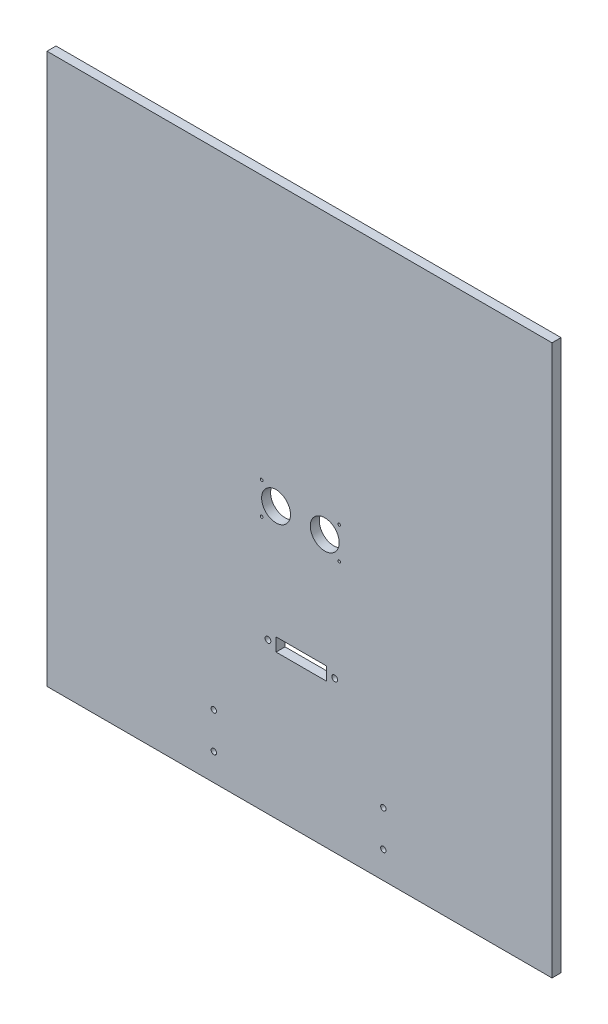
ISO-10303-21;
HEADER;
FILE_DESCRIPTION(('STEP AP214'),'2;1');
FILE_NAME('part.step','',(''),(''),'','','');
FILE_SCHEMA(('AUTOMOTIVE_DESIGN { 1 0 10303 214 1 1 1 1 }'));
ENDSEC;
DATA;
#1=APPLICATION_CONTEXT('core data for automotive mechanical design processes');
#2=APPLICATION_PROTOCOL_DEFINITION('international standard','automotive_design',2000,#1);
#3=PRODUCT_CONTEXT('',#1,'mechanical');
#4=PRODUCT('Part','Part','',(#3));
#5=PRODUCT_RELATED_PRODUCT_CATEGORY('part','',(#4));
#6=PRODUCT_DEFINITION_FORMATION('','',#4);
#7=PRODUCT_DEFINITION_CONTEXT('part definition',#1,'design');
#8=PRODUCT_DEFINITION('design','',#6,#7);
#9=PRODUCT_DEFINITION_SHAPE('','',#8);
#10=(LENGTH_UNIT() NAMED_UNIT(*) SI_UNIT(.MILLI.,.METRE.));
#11=(NAMED_UNIT(*) PLANE_ANGLE_UNIT() SI_UNIT($,.RADIAN.));
#12=(NAMED_UNIT(*) SI_UNIT($,.STERADIAN.) SOLID_ANGLE_UNIT());
#13=UNCERTAINTY_MEASURE_WITH_UNIT(LENGTH_MEASURE(1.E-05),#10,'distance_accuracy_value','');
#14=(GEOMETRIC_REPRESENTATION_CONTEXT(3) GLOBAL_UNCERTAINTY_ASSIGNED_CONTEXT((#13)) GLOBAL_UNIT_ASSIGNED_CONTEXT((#10,
#11,#12)) REPRESENTATION_CONTEXT('',''));
#15=CARTESIAN_POINT('',(0.,0.,0.));
#16=DIRECTION('',(0.,0.,1.));
#17=DIRECTION('',(1.,0.,0.));
#18=AXIS2_PLACEMENT_3D('',#15,#16,#17);
#19=CARTESIAN_POINT('',(0.,0.,5.));
#20=DIRECTION('',(1.,0.,0.));
#21=DIRECTION('',(0.,0.,-1.));
#22=AXIS2_PLACEMENT_3D('',#19,#20,#21);
#23=PLANE('',#22);
#24=DIRECTION('',(0.,-1.,0.));
#25=VECTOR('',#24,1.);
#26=CARTESIAN_POINT('',(0.,0.,0.));
#27=LINE('',#26,#25);
#28=CARTESIAN_POINT('',(0.,305.,0.));
#29=VERTEX_POINT('',#28);
#30=CARTESIAN_POINT('',(0.,0.,0.));
#31=VERTEX_POINT('',#30);
#32=EDGE_CURVE('E158',#29,#31,#27,.T.);
#33=ORIENTED_EDGE('',*,*,#32,.T.);
#34=DIRECTION('',(0.,0.,-1.));
#35=VECTOR('',#34,1.);
#36=CARTESIAN_POINT('',(0.,0.,5.));
#37=LINE('',#36,#35);
#38=CARTESIAN_POINT('',(0.,0.,5.));
#39=VERTEX_POINT('',#38);
#40=EDGE_CURVE('E11',#39,#31,#37,.T.);
#41=ORIENTED_EDGE('',*,*,#40,.F.);
#42=DIRECTION('',(0.,-1.,0.));
#43=VECTOR('',#42,1.);
#44=CARTESIAN_POINT('',(0.,0.,5.));
#45=LINE('',#44,#43);
#46=CARTESIAN_POINT('',(0.,305.,5.));
#47=VERTEX_POINT('',#46);
#48=EDGE_CURVE('E161',#47,#39,#45,.T.);
#49=ORIENTED_EDGE('',*,*,#48,.F.);
#50=DIRECTION('',(0.,0.,-1.));
#51=VECTOR('',#50,1.);
#52=CARTESIAN_POINT('',(0.,305.,5.));
#53=LINE('',#52,#51);
#54=EDGE_CURVE('E171',#47,#29,#53,.T.);
#55=ORIENTED_EDGE('',*,*,#54,.T.);
#56=EDGE_LOOP('',(#33,#41,#49,#55));
#57=FACE_BOUND('',#56,.T.);
#58=ADVANCED_FACE('F32',(#57),#23,.F.);
#59=CARTESIAN_POINT('',(0.,0.,5.));
#60=DIRECTION('',(0.,1.,0.));
#61=DIRECTION('',(0.,0.,1.));
#62=AXIS2_PLACEMENT_3D('',#59,#60,#61);
#63=PLANE('',#62);
#64=DIRECTION('',(1.,0.,0.));
#65=VECTOR('',#64,1.);
#66=CARTESIAN_POINT('',(0.,0.,0.));
#67=LINE('',#66,#65);
#68=CARTESIAN_POINT('',(280.,0.,0.));
#69=VERTEX_POINT('',#68);
#70=EDGE_CURVE('E174',#31,#69,#67,.T.);
#71=ORIENTED_EDGE('',*,*,#70,.T.);
#72=DIRECTION('',(0.,0.,-1.));
#73=VECTOR('',#72,1.);
#74=CARTESIAN_POINT('',(280.,0.,5.));
#75=LINE('',#74,#73);
#76=CARTESIAN_POINT('',(280.,0.,5.));
#77=VERTEX_POINT('',#76);
#78=EDGE_CURVE('E39',#77,#69,#75,.T.);
#79=ORIENTED_EDGE('',*,*,#78,.F.);
#80=DIRECTION('',(1.,0.,0.));
#81=VECTOR('',#80,1.);
#82=CARTESIAN_POINT('',(0.,0.,5.));
#83=LINE('',#82,#81);
#84=EDGE_CURVE('E164',#39,#77,#83,.T.);
#85=ORIENTED_EDGE('',*,*,#84,.F.);
#86=ORIENTED_EDGE('',*,*,#40,.T.);
#87=EDGE_LOOP('',(#71,#79,#85,#86));
#88=FACE_BOUND('',#87,.T.);
#89=ADVANCED_FACE('F203',(#88),#63,.F.);
#90=CARTESIAN_POINT('',(280.,0.,5.));
#91=DIRECTION('',(-1.,0.,0.));
#92=DIRECTION('',(0.,0.,1.));
#93=AXIS2_PLACEMENT_3D('',#90,#91,#92);
#94=PLANE('',#93);
#95=DIRECTION('',(0.,1.,0.));
#96=VECTOR('',#95,1.);
#97=CARTESIAN_POINT('',(280.,0.,0.));
#98=LINE('',#97,#96);
#99=CARTESIAN_POINT('',(280.,305.,0.));
#100=VERTEX_POINT('',#99);
#101=EDGE_CURVE('E176',#69,#100,#98,.T.);
#102=ORIENTED_EDGE('',*,*,#101,.T.);
#103=DIRECTION('',(0.,0.,-1.));
#104=VECTOR('',#103,1.);
#105=CARTESIAN_POINT('',(280.,305.,5.));
#106=LINE('',#105,#104);
#107=CARTESIAN_POINT('',(280.,305.,5.));
#108=VERTEX_POINT('',#107);
#109=EDGE_CURVE('E181',#108,#100,#106,.T.);
#110=ORIENTED_EDGE('',*,*,#109,.F.);
#111=DIRECTION('',(0.,1.,0.));
#112=VECTOR('',#111,1.);
#113=CARTESIAN_POINT('',(280.,0.,5.));
#114=LINE('',#113,#112);
#115=EDGE_CURVE('E167',#77,#108,#114,.T.);
#116=ORIENTED_EDGE('',*,*,#115,.F.);
#117=ORIENTED_EDGE('',*,*,#78,.T.);
#118=EDGE_LOOP('',(#102,#110,#116,#117));
#119=FACE_BOUND('',#118,.T.);
#120=ADVANCED_FACE('F188',(#119),#94,.F.);
#121=CARTESIAN_POINT('',(0.,305.,5.));
#122=DIRECTION('',(0.,-1.,0.));
#123=DIRECTION('',(0.,0.,-1.));
#124=AXIS2_PLACEMENT_3D('',#121,#122,#123);
#125=PLANE('',#124);
#126=DIRECTION('',(-1.,0.,0.));
#127=VECTOR('',#126,1.);
#128=CARTESIAN_POINT('',(0.,305.,0.));
#129=LINE('',#128,#127);
#130=EDGE_CURVE('E165',#100,#29,#129,.T.);
#131=ORIENTED_EDGE('',*,*,#130,.T.);
#132=ORIENTED_EDGE('',*,*,#54,.F.);
#133=DIRECTION('',(-1.,0.,0.));
#134=VECTOR('',#133,1.);
#135=CARTESIAN_POINT('',(0.,305.,5.));
#136=LINE('',#135,#134);
#137=EDGE_CURVE('E169',#108,#47,#136,.T.);
#138=ORIENTED_EDGE('',*,*,#137,.F.);
#139=ORIENTED_EDGE('',*,*,#109,.T.);
#140=EDGE_LOOP('',(#131,#132,#138,#139));
#141=FACE_BOUND('',#140,.T.);
#142=ADVANCED_FACE('F197',(#141),#125,.F.);
#143=CARTESIAN_POINT('',(0.,0.,5.));
#144=DIRECTION('',(0.,0.,-1.));
#145=DIRECTION('',(-1.,0.,0.));
#146=AXIS2_PLACEMENT_3D('',#143,#144,#145);
#147=PLANE('',#146);
#148=CARTESIAN_POINT('',(119.,141.,5.));
#149=DIRECTION('',(0.,0.,-1.));
#150=DIRECTION('',(-1.,0.,0.));
#151=AXIS2_PLACEMENT_3D('',#148,#149,#150);
#152=CIRCLE('',#151,0.749999999999999);
#153=CARTESIAN_POINT('',(118.25,141.,5.));
#154=VERTEX_POINT('',#153);
#155=EDGE_CURVE('E297',#154,#154,#152,.T.);
#156=ORIENTED_EDGE('',*,*,#155,.T.);
#157=EDGE_LOOP('',(#156));
#158=FACE_BOUND('',#157,.T.);
#159=CARTESIAN_POINT('',(162.,141.,5.));
#160=DIRECTION('',(0.,0.,-1.));
#161=DIRECTION('',(-1.,0.,0.));
#162=AXIS2_PLACEMENT_3D('',#159,#160,#161);
#163=CIRCLE('',#162,0.750000000000012);
#164=CARTESIAN_POINT('',(161.25,141.,5.));
#165=VERTEX_POINT('',#164);
#166=EDGE_CURVE('E287',#165,#165,#163,.T.);
#167=ORIENTED_EDGE('',*,*,#166,.T.);
#168=EDGE_LOOP('',(#167));
#169=FACE_BOUND('',#168,.T.);
#170=CARTESIAN_POINT('',(162.,158.7,5.));
#171=DIRECTION('',(0.,0.,-1.));
#172=DIRECTION('',(-1.,0.,0.));
#173=AXIS2_PLACEMENT_3D('',#170,#171,#172);
#174=CIRCLE('',#173,0.750000000000012);
#175=CARTESIAN_POINT('',(161.25,158.7,5.));
#176=VERTEX_POINT('',#175);
#177=EDGE_CURVE('E282',#176,#176,#174,.T.);
#178=ORIENTED_EDGE('',*,*,#177,.T.);
#179=EDGE_LOOP('',(#178));
#180=FACE_BOUND('',#179,.T.);
#181=CARTESIAN_POINT('',(127.,150.,5.));
#182=DIRECTION('',(0.,0.,-1.));
#183=DIRECTION('',(-1.,0.,0.));
#184=AXIS2_PLACEMENT_3D('',#181,#182,#183);
#185=CIRCLE('',#184,8.00000000000004);
#186=CARTESIAN_POINT('',(119.,150.,5.));
#187=VERTEX_POINT('',#186);
#188=EDGE_CURVE('E309',#187,#187,#185,.T.);
#189=ORIENTED_EDGE('',*,*,#188,.T.);
#190=EDGE_LOOP('',(#189));
#191=FACE_BOUND('',#190,.T.);
#192=CARTESIAN_POINT('',(119.,158.7,5.));
#193=DIRECTION('',(0.,0.,-1.));
#194=DIRECTION('',(-1.,0.,0.));
#195=AXIS2_PLACEMENT_3D('',#192,#193,#194);
#196=CIRCLE('',#195,0.749999999999999);
#197=CARTESIAN_POINT('',(118.25,158.7,5.));
#198=VERTEX_POINT('',#197);
#199=EDGE_CURVE('E303',#198,#198,#196,.T.);
#200=ORIENTED_EDGE('',*,*,#199,.T.);
#201=EDGE_LOOP('',(#200));
#202=FACE_BOUND('',#201,.T.);
#203=CARTESIAN_POINT('',(154.,150.,5.));
#204=DIRECTION('',(0.,0.,-1.));
#205=DIRECTION('',(-1.,0.,0.));
#206=AXIS2_PLACEMENT_3D('',#203,#204,#205);
#207=CIRCLE('',#206,8.00000000000001);
#208=CARTESIAN_POINT('',(146.,150.,5.));
#209=VERTEX_POINT('',#208);
#210=EDGE_CURVE('E315',#209,#209,#207,.T.);
#211=ORIENTED_EDGE('',*,*,#210,.T.);
#212=EDGE_LOOP('',(#211));
#213=FACE_BOUND('',#212,.T.);
#214=CARTESIAN_POINT('',(159.5,83.65,5.));
#215=DIRECTION('',(0.,0.,-1.));
#216=DIRECTION('',(-1.,0.,0.));
#217=AXIS2_PLACEMENT_3D('',#214,#215,#216);
#218=CIRCLE('',#217,1.59999999999999);
#219=CARTESIAN_POINT('',(157.9,83.65,5.));
#220=VERTEX_POINT('',#219);
#221=EDGE_CURVE('E127',#220,#220,#218,.T.);
#222=ORIENTED_EDGE('',*,*,#221,.T.);
#223=EDGE_LOOP('',(#222));
#224=FACE_BOUND('',#223,.T.);
#225=CARTESIAN_POINT('',(122.5,83.65,5.));
#226=DIRECTION('',(0.,0.,-1.));
#227=DIRECTION('',(-1.,0.,0.));
#228=AXIS2_PLACEMENT_3D('',#225,#226,#227);
#229=CIRCLE('',#228,1.60000000000001);
#230=CARTESIAN_POINT('',(120.9,83.65,5.));
#231=VERTEX_POINT('',#230);
#232=EDGE_CURVE('E324',#231,#231,#229,.T.);
#233=ORIENTED_EDGE('',*,*,#232,.T.);
#234=EDGE_LOOP('',(#233));
#235=FACE_BOUND('',#234,.T.);
#236=DIRECTION('',(1.,0.,0.));
#237=VECTOR('',#236,1.);
#238=CARTESIAN_POINT('',(155.,87.3,5.));
#239=LINE('',#238,#237);
#240=CARTESIAN_POINT('',(127.,87.3,5.));
#241=VERTEX_POINT('',#240);
#242=CARTESIAN_POINT('',(155.,87.3,5.));
#243=VERTEX_POINT('',#242);
#244=EDGE_CURVE('E104',#241,#243,#239,.T.);
#245=ORIENTED_EDGE('',*,*,#244,.T.);
#246=DIRECTION('',(0.,-1.,0.));
#247=VECTOR('',#246,1.);
#248=CARTESIAN_POINT('',(155.,87.3,5.));
#249=LINE('',#248,#247);
#250=CARTESIAN_POINT('',(155.,80.,5.));
#251=VERTEX_POINT('',#250);
#252=EDGE_CURVE('E98',#243,#251,#249,.T.);
#253=ORIENTED_EDGE('',*,*,#252,.T.);
#254=DIRECTION('',(-1.,0.,0.));
#255=VECTOR('',#254,1.);
#256=CARTESIAN_POINT('',(155.,80.,5.));
#257=LINE('',#256,#255);
#258=CARTESIAN_POINT('',(127.,80.,5.));
#259=VERTEX_POINT('',#258);
#260=EDGE_CURVE('E107',#251,#259,#257,.T.);
#261=ORIENTED_EDGE('',*,*,#260,.T.);
#262=DIRECTION('',(0.,1.,0.));
#263=VECTOR('',#262,1.);
#264=CARTESIAN_POINT('',(127.,87.3,5.));
#265=LINE('',#264,#263);
#266=EDGE_CURVE('E46',#259,#241,#265,.T.);
#267=ORIENTED_EDGE('',*,*,#266,.T.);
#268=EDGE_LOOP('',(#245,#253,#261,#267));
#269=FACE_BOUND('',#268,.T.);
#270=CARTESIAN_POINT('',(92.4999999999992,15.,5.));
#271=DIRECTION('',(0.,0.,1.));
#272=DIRECTION('',(1.,0.,0.));
#273=AXIS2_PLACEMENT_3D('',#270,#271,#272);
#274=CIRCLE('',#273,1.5);
#275=CARTESIAN_POINT('',(93.9999999999992,15.,5.));
#276=VERTEX_POINT('',#275);
#277=EDGE_CURVE('E141',#276,#276,#274,.T.);
#278=ORIENTED_EDGE('',*,*,#277,.F.);
#279=EDGE_LOOP('',(#278));
#280=FACE_BOUND('',#279,.T.);
#281=CARTESIAN_POINT('',(186.5,35.,5.));
#282=DIRECTION('',(0.,0.,1.));
#283=DIRECTION('',(1.,0.,0.));
#284=AXIS2_PLACEMENT_3D('',#281,#282,#283);
#285=CIRCLE('',#284,1.5);
#286=CARTESIAN_POINT('',(188.,35.,5.));
#287=VERTEX_POINT('',#286);
#288=EDGE_CURVE('E147',#287,#287,#285,.T.);
#289=ORIENTED_EDGE('',*,*,#288,.F.);
#290=EDGE_LOOP('',(#289));
#291=FACE_BOUND('',#290,.T.);
#292=CARTESIAN_POINT('',(186.5,15.,5.));
#293=DIRECTION('',(0.,0.,1.));
#294=DIRECTION('',(1.,0.,0.));
#295=AXIS2_PLACEMENT_3D('',#292,#293,#294);
#296=CIRCLE('',#295,1.5);
#297=CARTESIAN_POINT('',(188.,15.,5.));
#298=VERTEX_POINT('',#297);
#299=EDGE_CURVE('E133',#298,#298,#296,.T.);
#300=ORIENTED_EDGE('',*,*,#299,.F.);
#301=EDGE_LOOP('',(#300));
#302=FACE_BOUND('',#301,.T.);
#303=CARTESIAN_POINT('',(92.4999999999992,35.,5.));
#304=DIRECTION('',(0.,0.,1.));
#305=DIRECTION('',(1.,0.,0.));
#306=AXIS2_PLACEMENT_3D('',#303,#304,#305);
#307=CIRCLE('',#306,1.5);
#308=CARTESIAN_POINT('',(93.9999999999992,35.,5.));
#309=VERTEX_POINT('',#308);
#310=EDGE_CURVE('E140',#309,#309,#307,.T.);
#311=ORIENTED_EDGE('',*,*,#310,.F.);
#312=EDGE_LOOP('',(#311));
#313=FACE_BOUND('',#312,.T.);
#314=ORIENTED_EDGE('',*,*,#48,.T.);
#315=ORIENTED_EDGE('',*,*,#84,.T.);
#316=ORIENTED_EDGE('',*,*,#115,.T.);
#317=ORIENTED_EDGE('',*,*,#137,.T.);
#318=EDGE_LOOP('',(#314,#315,#316,#317));
#319=FACE_BOUND('',#318,.T.);
#320=ADVANCED_FACE('F111',(#158,#169,#180,#191,#202,#213,#224,#235,#269,#280,#291,#302,#313,
#319),#147,.F.);
#321=CARTESIAN_POINT('',(0.,0.,0.));
#322=DIRECTION('',(0.,0.,-1.));
#323=DIRECTION('',(-1.,0.,0.));
#324=AXIS2_PLACEMENT_3D('',#321,#322,#323);
#325=PLANE('',#324);
#326=CARTESIAN_POINT('',(119.,141.,0.));
#327=DIRECTION('',(0.,0.,-1.));
#328=DIRECTION('',(-1.,0.,0.));
#329=AXIS2_PLACEMENT_3D('',#326,#327,#328);
#330=CIRCLE('',#329,0.749999999999999);
#331=CARTESIAN_POINT('',(118.25,141.,0.));
#332=VERTEX_POINT('',#331);
#333=EDGE_CURVE('E300',#332,#332,#330,.T.);
#334=ORIENTED_EDGE('',*,*,#333,.F.);
#335=EDGE_LOOP('',(#334));
#336=FACE_BOUND('',#335,.T.);
#337=CARTESIAN_POINT('',(162.,141.,0.));
#338=DIRECTION('',(0.,0.,-1.));
#339=DIRECTION('',(-1.,0.,0.));
#340=AXIS2_PLACEMENT_3D('',#337,#338,#339);
#341=CIRCLE('',#340,0.750000000000012);
#342=CARTESIAN_POINT('',(161.25,141.,0.));
#343=VERTEX_POINT('',#342);
#344=EDGE_CURVE('E292',#343,#343,#341,.T.);
#345=ORIENTED_EDGE('',*,*,#344,.F.);
#346=EDGE_LOOP('',(#345));
#347=FACE_BOUND('',#346,.T.);
#348=CARTESIAN_POINT('',(162.,158.7,0.));
#349=DIRECTION('',(0.,0.,-1.));
#350=DIRECTION('',(-1.,0.,0.));
#351=AXIS2_PLACEMENT_3D('',#348,#349,#350);
#352=CIRCLE('',#351,0.750000000000012);
#353=CARTESIAN_POINT('',(161.25,158.7,0.));
#354=VERTEX_POINT('',#353);
#355=EDGE_CURVE('E285',#354,#354,#352,.T.);
#356=ORIENTED_EDGE('',*,*,#355,.F.);
#357=EDGE_LOOP('',(#356));
#358=FACE_BOUND('',#357,.T.);
#359=CARTESIAN_POINT('',(127.,150.,0.));
#360=DIRECTION('',(0.,0.,-1.));
#361=DIRECTION('',(-1.,0.,0.));
#362=AXIS2_PLACEMENT_3D('',#359,#360,#361);
#363=CIRCLE('',#362,8.00000000000004);
#364=CARTESIAN_POINT('',(119.,150.,0.));
#365=VERTEX_POINT('',#364);
#366=EDGE_CURVE('E306',#365,#365,#363,.T.);
#367=ORIENTED_EDGE('',*,*,#366,.F.);
#368=EDGE_LOOP('',(#367));
#369=FACE_BOUND('',#368,.T.);
#370=CARTESIAN_POINT('',(119.,158.7,0.));
#371=DIRECTION('',(0.,0.,-1.));
#372=DIRECTION('',(-1.,0.,0.));
#373=AXIS2_PLACEMENT_3D('',#370,#371,#372);
#374=CIRCLE('',#373,0.749999999999999);
#375=CARTESIAN_POINT('',(118.25,158.7,0.));
#376=VERTEX_POINT('',#375);
#377=EDGE_CURVE('E289',#376,#376,#374,.T.);
#378=ORIENTED_EDGE('',*,*,#377,.F.);
#379=EDGE_LOOP('',(#378));
#380=FACE_BOUND('',#379,.T.);
#381=CARTESIAN_POINT('',(154.,150.,0.));
#382=DIRECTION('',(0.,0.,-1.));
#383=DIRECTION('',(-1.,0.,0.));
#384=AXIS2_PLACEMENT_3D('',#381,#382,#383);
#385=CIRCLE('',#384,8.00000000000001);
#386=CARTESIAN_POINT('',(146.,150.,0.));
#387=VERTEX_POINT('',#386);
#388=EDGE_CURVE('E312',#387,#387,#385,.T.);
#389=ORIENTED_EDGE('',*,*,#388,.F.);
#390=EDGE_LOOP('',(#389));
#391=FACE_BOUND('',#390,.T.);
#392=CARTESIAN_POINT('',(159.5,83.65,0.));
#393=DIRECTION('',(0.,0.,-1.));
#394=DIRECTION('',(-1.,0.,0.));
#395=AXIS2_PLACEMENT_3D('',#392,#393,#394);
#396=CIRCLE('',#395,1.59999999999999);
#397=CARTESIAN_POINT('',(157.9,83.65,0.));
#398=VERTEX_POINT('',#397);
#399=EDGE_CURVE('E322',#398,#398,#396,.T.);
#400=ORIENTED_EDGE('',*,*,#399,.F.);
#401=EDGE_LOOP('',(#400));
#402=FACE_BOUND('',#401,.T.);
#403=CARTESIAN_POINT('',(122.5,83.65,0.));
#404=DIRECTION('',(0.,0.,-1.));
#405=DIRECTION('',(-1.,0.,0.));
#406=AXIS2_PLACEMENT_3D('',#403,#404,#405);
#407=CIRCLE('',#406,1.60000000000001);
#408=CARTESIAN_POINT('',(120.9,83.65,0.));
#409=VERTEX_POINT('',#408);
#410=EDGE_CURVE('E120',#409,#409,#407,.T.);
#411=ORIENTED_EDGE('',*,*,#410,.F.);
#412=EDGE_LOOP('',(#411));
#413=FACE_BOUND('',#412,.T.);
#414=DIRECTION('',(0.,-1.,0.));
#415=VECTOR('',#414,1.);
#416=CARTESIAN_POINT('',(155.,87.3,0.));
#417=LINE('',#416,#415);
#418=CARTESIAN_POINT('',(155.,87.3,0.));
#419=VERTEX_POINT('',#418);
#420=CARTESIAN_POINT('',(155.,80.,0.));
#421=VERTEX_POINT('',#420);
#422=EDGE_CURVE('E54',#419,#421,#417,.T.);
#423=ORIENTED_EDGE('',*,*,#422,.F.);
#424=DIRECTION('',(1.,0.,0.));
#425=VECTOR('',#424,1.);
#426=CARTESIAN_POINT('',(155.,87.3,0.));
#427=LINE('',#426,#425);
#428=CARTESIAN_POINT('',(127.,87.3,0.));
#429=VERTEX_POINT('',#428);
#430=EDGE_CURVE('E114',#429,#419,#427,.T.);
#431=ORIENTED_EDGE('',*,*,#430,.F.);
#432=DIRECTION('',(0.,1.,0.));
#433=VECTOR('',#432,1.);
#434=CARTESIAN_POINT('',(127.,87.3,0.));
#435=LINE('',#434,#433);
#436=CARTESIAN_POINT('',(127.,80.,0.));
#437=VERTEX_POINT('',#436);
#438=EDGE_CURVE('E117',#437,#429,#435,.T.);
#439=ORIENTED_EDGE('',*,*,#438,.F.);
#440=DIRECTION('',(-1.,0.,0.));
#441=VECTOR('',#440,1.);
#442=CARTESIAN_POINT('',(155.,80.,0.));
#443=LINE('',#442,#441);
#444=EDGE_CURVE('E126',#421,#437,#443,.T.);
#445=ORIENTED_EDGE('',*,*,#444,.F.);
#446=EDGE_LOOP('',(#423,#431,#439,#445));
#447=FACE_BOUND('',#446,.T.);
#448=CARTESIAN_POINT('',(92.4999999999992,15.,0.));
#449=DIRECTION('',(0.,0.,1.));
#450=DIRECTION('',(1.,0.,0.));
#451=AXIS2_PLACEMENT_3D('',#448,#449,#450);
#452=CIRCLE('',#451,1.5);
#453=CARTESIAN_POINT('',(93.9999999999992,15.,0.));
#454=VERTEX_POINT('',#453);
#455=EDGE_CURVE('E137',#454,#454,#452,.T.);
#456=ORIENTED_EDGE('',*,*,#455,.T.);
#457=EDGE_LOOP('',(#456));
#458=FACE_BOUND('',#457,.T.);
#459=CARTESIAN_POINT('',(186.5,35.,0.));
#460=DIRECTION('',(0.,0.,1.));
#461=DIRECTION('',(1.,0.,0.));
#462=AXIS2_PLACEMENT_3D('',#459,#460,#461);
#463=CIRCLE('',#462,1.5);
#464=CARTESIAN_POINT('',(188.,35.,0.));
#465=VERTEX_POINT('',#464);
#466=EDGE_CURVE('E144',#465,#465,#463,.T.);
#467=ORIENTED_EDGE('',*,*,#466,.T.);
#468=EDGE_LOOP('',(#467));
#469=FACE_BOUND('',#468,.T.);
#470=CARTESIAN_POINT('',(186.5,15.,0.));
#471=DIRECTION('',(0.,0.,1.));
#472=DIRECTION('',(1.,0.,0.));
#473=AXIS2_PLACEMENT_3D('',#470,#471,#472);
#474=CIRCLE('',#473,1.5);
#475=CARTESIAN_POINT('',(188.,15.,0.));
#476=VERTEX_POINT('',#475);
#477=EDGE_CURVE('E150',#476,#476,#474,.T.);
#478=ORIENTED_EDGE('',*,*,#477,.T.);
#479=EDGE_LOOP('',(#478));
#480=FACE_BOUND('',#479,.T.);
#481=CARTESIAN_POINT('',(92.4999999999992,35.,0.));
#482=DIRECTION('',(0.,0.,1.));
#483=DIRECTION('',(1.,0.,0.));
#484=AXIS2_PLACEMENT_3D('',#481,#482,#483);
#485=CIRCLE('',#484,1.5);
#486=CARTESIAN_POINT('',(93.9999999999992,35.,0.));
#487=VERTEX_POINT('',#486);
#488=EDGE_CURVE('E155',#487,#487,#485,.T.);
#489=ORIENTED_EDGE('',*,*,#488,.T.);
#490=EDGE_LOOP('',(#489));
#491=FACE_BOUND('',#490,.T.);
#492=ORIENTED_EDGE('',*,*,#32,.F.);
#493=ORIENTED_EDGE('',*,*,#130,.F.);
#494=ORIENTED_EDGE('',*,*,#101,.F.);
#495=ORIENTED_EDGE('',*,*,#70,.F.);
#496=EDGE_LOOP('',(#492,#493,#494,#495));
#497=FACE_BOUND('',#496,.T.);
#498=ADVANCED_FACE('F194',(#336,#347,#358,#369,#380,#391,#402,#413,#447,#458,#469,#480,#491,
#497),#325,.T.);
#499=CARTESIAN_POINT('',(92.4999999999992,35.,0.));
#500=DIRECTION('',(0.,0.,1.));
#501=DIRECTION('',(1.,0.,0.));
#502=AXIS2_PLACEMENT_3D('',#499,#500,#501);
#503=CYLINDRICAL_SURFACE('',#502,1.5);
#504=ORIENTED_EDGE('',*,*,#488,.F.);
#505=EDGE_LOOP('',(#504));
#506=FACE_BOUND('',#505,.T.);
#507=ORIENTED_EDGE('',*,*,#310,.T.);
#508=EDGE_LOOP('',(#507));
#509=FACE_BOUND('',#508,.T.);
#510=ADVANCED_FACE('F215',(#506,#509),#503,.F.);
#511=CARTESIAN_POINT('',(186.5,15.,0.));
#512=DIRECTION('',(0.,0.,1.));
#513=DIRECTION('',(1.,0.,0.));
#514=AXIS2_PLACEMENT_3D('',#511,#512,#513);
#515=CYLINDRICAL_SURFACE('',#514,1.5);
#516=ORIENTED_EDGE('',*,*,#477,.F.);
#517=EDGE_LOOP('',(#516));
#518=FACE_BOUND('',#517,.T.);
#519=ORIENTED_EDGE('',*,*,#299,.T.);
#520=EDGE_LOOP('',(#519));
#521=FACE_BOUND('',#520,.T.);
#522=ADVANCED_FACE('F222',(#518,#521),#515,.F.);
#523=CARTESIAN_POINT('',(186.5,35.,0.));
#524=DIRECTION('',(0.,0.,1.));
#525=DIRECTION('',(1.,0.,0.));
#526=AXIS2_PLACEMENT_3D('',#523,#524,#525);
#527=CYLINDRICAL_SURFACE('',#526,1.5);
#528=ORIENTED_EDGE('',*,*,#466,.F.);
#529=EDGE_LOOP('',(#528));
#530=FACE_BOUND('',#529,.T.);
#531=ORIENTED_EDGE('',*,*,#288,.T.);
#532=EDGE_LOOP('',(#531));
#533=FACE_BOUND('',#532,.T.);
#534=ADVANCED_FACE('F226',(#530,#533),#527,.F.);
#535=CARTESIAN_POINT('',(92.4999999999992,15.,0.));
#536=DIRECTION('',(0.,0.,1.));
#537=DIRECTION('',(1.,0.,0.));
#538=AXIS2_PLACEMENT_3D('',#535,#536,#537);
#539=CYLINDRICAL_SURFACE('',#538,1.5);
#540=ORIENTED_EDGE('',*,*,#455,.F.);
#541=EDGE_LOOP('',(#540));
#542=FACE_BOUND('',#541,.T.);
#543=ORIENTED_EDGE('',*,*,#277,.T.);
#544=EDGE_LOOP('',(#543));
#545=FACE_BOUND('',#544,.T.);
#546=ADVANCED_FACE('F230',(#542,#545),#539,.F.);
#547=CARTESIAN_POINT('',(155.,87.3,5.));
#548=DIRECTION('',(1.,0.,0.));
#549=DIRECTION('',(0.,0.,-1.));
#550=AXIS2_PLACEMENT_3D('',#547,#548,#549);
#551=PLANE('',#550);
#552=ORIENTED_EDGE('',*,*,#422,.T.);
#553=DIRECTION('',(0.,0.,-1.));
#554=VECTOR('',#553,1.);
#555=CARTESIAN_POINT('',(155.,80.,5.));
#556=LINE('',#555,#554);
#557=EDGE_CURVE('E94',#251,#421,#556,.T.);
#558=ORIENTED_EDGE('',*,*,#557,.F.);
#559=ORIENTED_EDGE('',*,*,#252,.F.);
#560=DIRECTION('',(0.,0.,-1.));
#561=VECTOR('',#560,1.);
#562=CARTESIAN_POINT('',(155.,87.3,5.));
#563=LINE('',#562,#561);
#564=EDGE_CURVE('E131',#243,#419,#563,.T.);
#565=ORIENTED_EDGE('',*,*,#564,.T.);
#566=EDGE_LOOP('',(#552,#558,#559,#565));
#567=FACE_BOUND('',#566,.T.);
#568=ADVANCED_FACE('F96',(#567),#551,.F.);
#569=CARTESIAN_POINT('',(155.,87.3,5.));
#570=DIRECTION('',(0.,1.,0.));
#571=DIRECTION('',(0.,0.,1.));
#572=AXIS2_PLACEMENT_3D('',#569,#570,#571);
#573=PLANE('',#572);
#574=ORIENTED_EDGE('',*,*,#430,.T.);
#575=ORIENTED_EDGE('',*,*,#564,.F.);
#576=ORIENTED_EDGE('',*,*,#244,.F.);
#577=DIRECTION('',(0.,0.,-1.));
#578=VECTOR('',#577,1.);
#579=CARTESIAN_POINT('',(127.,87.3,5.));
#580=LINE('',#579,#578);
#581=EDGE_CURVE('E134',#241,#429,#580,.T.);
#582=ORIENTED_EDGE('',*,*,#581,.T.);
#583=EDGE_LOOP('',(#574,#575,#576,#582));
#584=FACE_BOUND('',#583,.T.);
#585=ADVANCED_FACE('F237',(#584),#573,.F.);
#586=CARTESIAN_POINT('',(127.,87.3,5.));
#587=DIRECTION('',(-1.,0.,0.));
#588=DIRECTION('',(0.,-1.,0.));
#589=AXIS2_PLACEMENT_3D('',#586,#587,#588);
#590=PLANE('',#589);
#591=ORIENTED_EDGE('',*,*,#438,.T.);
#592=ORIENTED_EDGE('',*,*,#581,.F.);
#593=ORIENTED_EDGE('',*,*,#266,.F.);
#594=DIRECTION('',(0.,0.,-1.));
#595=VECTOR('',#594,1.);
#596=CARTESIAN_POINT('',(127.,80.,5.));
#597=LINE('',#596,#595);
#598=EDGE_CURVE('E103',#259,#437,#597,.T.);
#599=ORIENTED_EDGE('',*,*,#598,.T.);
#600=EDGE_LOOP('',(#591,#592,#593,#599));
#601=FACE_BOUND('',#600,.T.);
#602=ADVANCED_FACE('F241',(#601),#590,.F.);
#603=CARTESIAN_POINT('',(155.,80.,5.));
#604=DIRECTION('',(0.,-1.,0.));
#605=DIRECTION('',(0.,0.,-1.));
#606=AXIS2_PLACEMENT_3D('',#603,#604,#605);
#607=PLANE('',#606);
#608=ORIENTED_EDGE('',*,*,#444,.T.);
#609=ORIENTED_EDGE('',*,*,#598,.F.);
#610=ORIENTED_EDGE('',*,*,#260,.F.);
#611=ORIENTED_EDGE('',*,*,#557,.T.);
#612=EDGE_LOOP('',(#608,#609,#610,#611));
#613=FACE_BOUND('',#612,.T.);
#614=ADVANCED_FACE('F108',(#613),#607,.F.);
#615=CARTESIAN_POINT('',(122.5,83.65,5.));
#616=DIRECTION('',(0.,0.,-1.));
#617=DIRECTION('',(-1.,0.,0.));
#618=AXIS2_PLACEMENT_3D('',#615,#616,#617);
#619=CYLINDRICAL_SURFACE('',#618,1.60000000000001);
#620=ORIENTED_EDGE('',*,*,#232,.F.);
#621=EDGE_LOOP('',(#620));
#622=FACE_BOUND('',#621,.T.);
#623=ORIENTED_EDGE('',*,*,#410,.T.);
#624=EDGE_LOOP('',(#623));
#625=FACE_BOUND('',#624,.T.);
#626=ADVANCED_FACE('F240',(#622,#625),#619,.F.);
#627=CARTESIAN_POINT('',(159.5,83.65,5.));
#628=DIRECTION('',(0.,0.,-1.));
#629=DIRECTION('',(-1.,0.,0.));
#630=AXIS2_PLACEMENT_3D('',#627,#628,#629);
#631=CYLINDRICAL_SURFACE('',#630,1.59999999999999);
#632=ORIENTED_EDGE('',*,*,#221,.F.);
#633=EDGE_LOOP('',(#632));
#634=FACE_BOUND('',#633,.T.);
#635=ORIENTED_EDGE('',*,*,#399,.T.);
#636=EDGE_LOOP('',(#635));
#637=FACE_BOUND('',#636,.T.);
#638=ADVANCED_FACE('F249',(#634,#637),#631,.F.);
#639=CARTESIAN_POINT('',(154.,150.,5.));
#640=DIRECTION('',(0.,0.,-1.));
#641=DIRECTION('',(-1.,0.,0.));
#642=AXIS2_PLACEMENT_3D('',#639,#640,#641);
#643=CYLINDRICAL_SURFACE('',#642,8.00000000000001);
#644=ORIENTED_EDGE('',*,*,#210,.F.);
#645=EDGE_LOOP('',(#644));
#646=FACE_BOUND('',#645,.T.);
#647=ORIENTED_EDGE('',*,*,#388,.T.);
#648=EDGE_LOOP('',(#647));
#649=FACE_BOUND('',#648,.T.);
#650=ADVANCED_FACE('F253',(#646,#649),#643,.F.);
#651=CARTESIAN_POINT('',(119.,158.7,5.));
#652=DIRECTION('',(0.,0.,-1.));
#653=DIRECTION('',(-1.,0.,0.));
#654=AXIS2_PLACEMENT_3D('',#651,#652,#653);
#655=CYLINDRICAL_SURFACE('',#654,0.749999999999999);
#656=ORIENTED_EDGE('',*,*,#199,.F.);
#657=EDGE_LOOP('',(#656));
#658=FACE_BOUND('',#657,.T.);
#659=ORIENTED_EDGE('',*,*,#377,.T.);
#660=EDGE_LOOP('',(#659));
#661=FACE_BOUND('',#660,.T.);
#662=ADVANCED_FACE('F257',(#658,#661),#655,.F.);
#663=CARTESIAN_POINT('',(127.,150.,5.));
#664=DIRECTION('',(0.,0.,-1.));
#665=DIRECTION('',(-1.,0.,0.));
#666=AXIS2_PLACEMENT_3D('',#663,#664,#665);
#667=CYLINDRICAL_SURFACE('',#666,8.00000000000004);
#668=ORIENTED_EDGE('',*,*,#188,.F.);
#669=EDGE_LOOP('',(#668));
#670=FACE_BOUND('',#669,.T.);
#671=ORIENTED_EDGE('',*,*,#366,.T.);
#672=EDGE_LOOP('',(#671));
#673=FACE_BOUND('',#672,.T.);
#674=ADVANCED_FACE('F259',(#670,#673),#667,.F.);
#675=CARTESIAN_POINT('',(162.,158.7,5.));
#676=DIRECTION('',(0.,0.,-1.));
#677=DIRECTION('',(-1.,0.,0.));
#678=AXIS2_PLACEMENT_3D('',#675,#676,#677);
#679=CYLINDRICAL_SURFACE('',#678,0.750000000000012);
#680=ORIENTED_EDGE('',*,*,#177,.F.);
#681=EDGE_LOOP('',(#680));
#682=FACE_BOUND('',#681,.T.);
#683=ORIENTED_EDGE('',*,*,#355,.T.);
#684=EDGE_LOOP('',(#683));
#685=FACE_BOUND('',#684,.T.);
#686=ADVANCED_FACE('F262',(#682,#685),#679,.F.);
#687=CARTESIAN_POINT('',(162.,141.,5.));
#688=DIRECTION('',(0.,0.,-1.));
#689=DIRECTION('',(-1.,0.,0.));
#690=AXIS2_PLACEMENT_3D('',#687,#688,#689);
#691=CYLINDRICAL_SURFACE('',#690,0.750000000000012);
#692=ORIENTED_EDGE('',*,*,#166,.F.);
#693=EDGE_LOOP('',(#692));
#694=FACE_BOUND('',#693,.T.);
#695=ORIENTED_EDGE('',*,*,#344,.T.);
#696=EDGE_LOOP('',(#695));
#697=FACE_BOUND('',#696,.T.);
#698=ADVANCED_FACE('F270',(#694,#697),#691,.F.);
#699=CARTESIAN_POINT('',(119.,141.,5.));
#700=DIRECTION('',(0.,0.,-1.));
#701=DIRECTION('',(-1.,0.,0.));
#702=AXIS2_PLACEMENT_3D('',#699,#700,#701);
#703=CYLINDRICAL_SURFACE('',#702,0.749999999999999);
#704=ORIENTED_EDGE('',*,*,#155,.F.);
#705=EDGE_LOOP('',(#704));
#706=FACE_BOUND('',#705,.T.);
#707=ORIENTED_EDGE('',*,*,#333,.T.);
#708=EDGE_LOOP('',(#707));
#709=FACE_BOUND('',#708,.T.);
#710=ADVANCED_FACE('F267',(#706,#709),#703,.F.);
#711=CLOSED_SHELL('',(#58,#89,#120,#142,#320,#498,#510,#522,#534,#546,#568,#585,#602,#614,#626,
#638,#650,#662,#674,#686,#698,#710));
#712=MANIFOLD_SOLID_BREP('B2',#711);
#713=ADVANCED_BREP_SHAPE_REPRESENTATION('',(#18,#712),#14);
#714=SHAPE_DEFINITION_REPRESENTATION(#9,#713);
ENDSEC;
END-ISO-10303-21;
